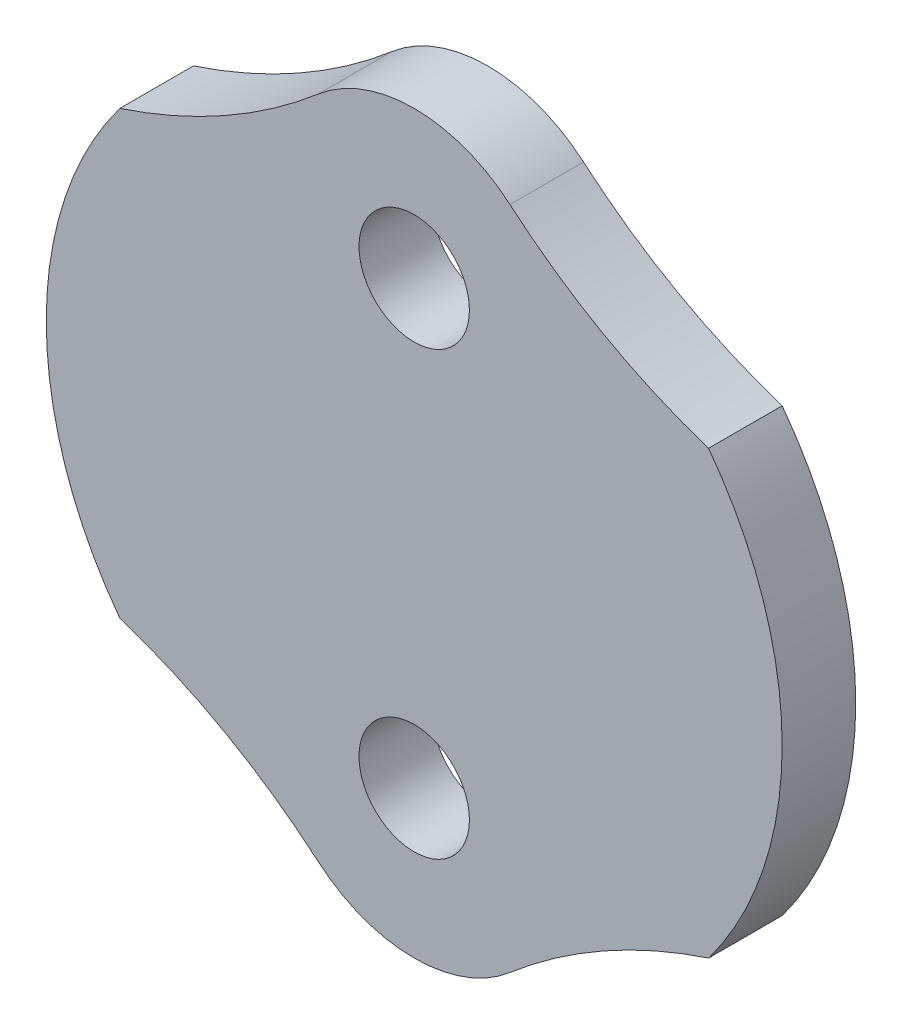
ISO-10303-21;
HEADER;
FILE_DESCRIPTION(('STEP AP214'),'2;1');
FILE_NAME('part.step','',(''),(''),'','','');
FILE_SCHEMA(('AUTOMOTIVE_DESIGN { 1 0 10303 214 1 1 1 1 }'));
ENDSEC;
DATA;
#1=APPLICATION_CONTEXT('core data for automotive mechanical design processes');
#2=APPLICATION_PROTOCOL_DEFINITION('international standard','automotive_design',2000,#1);
#3=PRODUCT_CONTEXT('',#1,'mechanical');
#4=PRODUCT('Part','Part','',(#3));
#5=PRODUCT_RELATED_PRODUCT_CATEGORY('part','',(#4));
#6=PRODUCT_DEFINITION_FORMATION('','',#4);
#7=PRODUCT_DEFINITION_CONTEXT('part definition',#1,'design');
#8=PRODUCT_DEFINITION('design','',#6,#7);
#9=PRODUCT_DEFINITION_SHAPE('','',#8);
#10=(LENGTH_UNIT() NAMED_UNIT(*) SI_UNIT(.MILLI.,.METRE.));
#11=(NAMED_UNIT(*) PLANE_ANGLE_UNIT() SI_UNIT($,.RADIAN.));
#12=(NAMED_UNIT(*) SI_UNIT($,.STERADIAN.) SOLID_ANGLE_UNIT());
#13=UNCERTAINTY_MEASURE_WITH_UNIT(LENGTH_MEASURE(1.E-05),#10,'distance_accuracy_value','');
#14=(GEOMETRIC_REPRESENTATION_CONTEXT(3) GLOBAL_UNCERTAINTY_ASSIGNED_CONTEXT((#13)) GLOBAL_UNIT_ASSIGNED_CONTEXT((#10,
#11,#12)) REPRESENTATION_CONTEXT('',''));
#15=CARTESIAN_POINT('',(0.,0.,0.));
#16=DIRECTION('',(0.,0.,1.));
#17=DIRECTION('',(1.,0.,0.));
#18=AXIS2_PLACEMENT_3D('',#15,#16,#17);
#19=CARTESIAN_POINT('',(0.,9.525,3.175));
#20=DIRECTION('',(0.,0.,1.));
#21=DIRECTION('',(1.,0.,0.));
#22=AXIS2_PLACEMENT_3D('',#19,#20,#21);
#23=PLANE('',#22);
#24=CARTESIAN_POINT('',(0.,19.05,3.175));
#25=DIRECTION('',(0.,0.,1.));
#26=DIRECTION('',(1.,0.,0.));
#27=AXIS2_PLACEMENT_3D('',#24,#25,#26);
#28=CIRCLE('',#27,2.38125);
#29=CARTESIAN_POINT('',(2.38125,19.05,3.175));
#30=VERTEX_POINT('',#29);
#31=EDGE_CURVE('E159',#30,#30,#28,.T.);
#32=ORIENTED_EDGE('',*,*,#31,.F.);
#33=EDGE_LOOP('',(#32));
#34=FACE_BOUND('',#33,.T.);
#35=CARTESIAN_POINT('',(0.,0.,3.175));
#36=DIRECTION('',(0.,0.,1.));
#37=DIRECTION('',(1.,0.,0.));
#38=AXIS2_PLACEMENT_3D('',#35,#36,#37);
#39=CIRCLE('',#38,2.38125);
#40=CARTESIAN_POINT('',(2.38125,0.,3.175));
#41=VERTEX_POINT('',#40);
#42=EDGE_CURVE('E165',#41,#41,#39,.T.);
#43=ORIENTED_EDGE('',*,*,#42,.F.);
#44=EDGE_LOOP('',(#43));
#45=FACE_BOUND('',#44,.T.);
#46=CARTESIAN_POINT('',(0.,9.525,3.175));
#47=DIRECTION('',(0.,0.,1.));
#48=DIRECTION('',(1.,0.,0.));
#49=AXIS2_PLACEMENT_3D('',#46,#47,#48);
#50=CIRCLE('',#49,15.875);
#51=CARTESIAN_POINT('',(-12.7,19.05,3.175));
#52=VERTEX_POINT('',#51);
#53=CARTESIAN_POINT('',(-12.7,0.,3.175));
#54=VERTEX_POINT('',#53);
#55=EDGE_CURVE('E11',#52,#54,#50,.T.);
#56=ORIENTED_EDGE('',*,*,#55,.T.);
#57=CARTESIAN_POINT('',(-20.5917749442092,-24.0466751482304,3.175));
#58=DIRECTION('',(0.,0.,1.));
#59=DIRECTION('',(1.,0.,0.));
#60=AXIS2_PLACEMENT_3D('',#57,#58,#59);
#61=CIRCLE('',#60,25.3085498884185);
#62=CARTESIAN_POINT('',(-4.13025142833731,-4.82322746081061,3.175));
#63=VERTEX_POINT('',#62);
#64=EDGE_CURVE('E125',#54,#63,#61,.F.);
#65=ORIENTED_EDGE('',*,*,#64,.T.);
#66=CARTESIAN_POINT('',(0.,0.,3.175));
#67=DIRECTION('',(0.,0.,1.));
#68=DIRECTION('',(1.,0.,0.));
#69=AXIS2_PLACEMENT_3D('',#66,#67,#68);
#70=CIRCLE('',#69,6.35);
#71=CARTESIAN_POINT('',(4.13025142833731,-4.82322746081061,3.175));
#72=VERTEX_POINT('',#71);
#73=EDGE_CURVE('E139',#63,#72,#70,.T.);
#74=ORIENTED_EDGE('',*,*,#73,.T.);
#75=CARTESIAN_POINT('',(20.5917749442092,-24.0466751482304,3.175));
#76=DIRECTION('',(0.,0.,1.));
#77=DIRECTION('',(1.,0.,0.));
#78=AXIS2_PLACEMENT_3D('',#75,#76,#77);
#79=CIRCLE('',#78,25.3085498884185);
#80=CARTESIAN_POINT('',(12.7,0.,3.175));
#81=VERTEX_POINT('',#80);
#82=EDGE_CURVE('E136',#81,#72,#79,.T.);
#83=ORIENTED_EDGE('',*,*,#82,.F.);
#84=CARTESIAN_POINT('',(12.7,19.05,3.175));
#85=VERTEX_POINT('',#84);
#86=EDGE_CURVE('E42',#81,#85,#50,.T.);
#87=ORIENTED_EDGE('',*,*,#86,.T.);
#88=CARTESIAN_POINT('',(20.5917749442092,43.0966751482304,3.175));
#89=DIRECTION('',(0.,0.,1.));
#90=DIRECTION('',(1.,0.,0.));
#91=AXIS2_PLACEMENT_3D('',#88,#89,#90);
#92=CIRCLE('',#91,25.3085498884185);
#93=CARTESIAN_POINT('',(4.13025142833731,23.8732274608106,3.175));
#94=VERTEX_POINT('',#93);
#95=EDGE_CURVE('E57',#85,#94,#92,.F.);
#96=ORIENTED_EDGE('',*,*,#95,.T.);
#97=CARTESIAN_POINT('',(0.,19.05,3.175));
#98=DIRECTION('',(0.,0.,1.));
#99=DIRECTION('',(1.,0.,0.));
#100=AXIS2_PLACEMENT_3D('',#97,#98,#99);
#101=CIRCLE('',#100,6.35);
#102=CARTESIAN_POINT('',(-4.13025142833731,23.8732274608106,3.175));
#103=VERTEX_POINT('',#102);
#104=EDGE_CURVE('E114',#94,#103,#101,.T.);
#105=ORIENTED_EDGE('',*,*,#104,.T.);
#106=CARTESIAN_POINT('',(-20.5917749442092,43.0966751482304,3.175));
#107=DIRECTION('',(0.,0.,1.));
#108=DIRECTION('',(1.,0.,0.));
#109=AXIS2_PLACEMENT_3D('',#106,#107,#108);
#110=CIRCLE('',#109,25.3085498884185);
#111=EDGE_CURVE('E122',#52,#103,#110,.T.);
#112=ORIENTED_EDGE('',*,*,#111,.F.);
#113=EDGE_LOOP('',(#56,#65,#74,#83,#87,#96,#105,#112));
#114=FACE_BOUND('',#113,.T.);
#115=ADVANCED_FACE('F33',(#34,#45,#114),#23,.T.);
#116=CARTESIAN_POINT('',(0.,9.525,0.));
#117=DIRECTION('',(0.,0.,1.));
#118=DIRECTION('',(1.,0.,0.));
#119=AXIS2_PLACEMENT_3D('',#116,#117,#118);
#120=PLANE('',#119);
#121=CARTESIAN_POINT('',(-20.5917749442092,-24.0466751482304,0.));
#122=DIRECTION('',(0.,0.,1.));
#123=DIRECTION('',(1.,0.,0.));
#124=AXIS2_PLACEMENT_3D('',#121,#122,#123);
#125=CIRCLE('',#124,25.3085498884185);
#126=CARTESIAN_POINT('',(-12.7,0.,0.));
#127=VERTEX_POINT('',#126);
#128=CARTESIAN_POINT('',(-4.13025142833731,-4.82322746081061,0.));
#129=VERTEX_POINT('',#128);
#130=EDGE_CURVE('E131',#127,#129,#125,.F.);
#131=ORIENTED_EDGE('',*,*,#130,.F.);
#132=CARTESIAN_POINT('',(0.,9.525,0.));
#133=DIRECTION('',(0.,0.,1.));
#134=DIRECTION('',(1.,0.,0.));
#135=AXIS2_PLACEMENT_3D('',#132,#133,#134);
#136=CIRCLE('',#135,15.875);
#137=CARTESIAN_POINT('',(-12.7,19.05,0.));
#138=VERTEX_POINT('',#137);
#139=EDGE_CURVE('E170',#138,#127,#136,.T.);
#140=ORIENTED_EDGE('',*,*,#139,.F.);
#141=CARTESIAN_POINT('',(-20.5917749442092,43.0966751482304,0.));
#142=DIRECTION('',(0.,0.,1.));
#143=DIRECTION('',(1.,0.,0.));
#144=AXIS2_PLACEMENT_3D('',#141,#142,#143);
#145=CIRCLE('',#144,25.3085498884185);
#146=CARTESIAN_POINT('',(-4.13025142833731,23.8732274608106,0.));
#147=VERTEX_POINT('',#146);
#148=EDGE_CURVE('E115',#138,#147,#145,.T.);
#149=ORIENTED_EDGE('',*,*,#148,.T.);
#150=CARTESIAN_POINT('',(0.,19.05,0.));
#151=DIRECTION('',(0.,0.,1.));
#152=DIRECTION('',(1.,0.,0.));
#153=AXIS2_PLACEMENT_3D('',#150,#151,#152);
#154=CIRCLE('',#153,6.35);
#155=CARTESIAN_POINT('',(4.13025142833731,23.8732274608106,0.));
#156=VERTEX_POINT('',#155);
#157=EDGE_CURVE('E108',#156,#147,#154,.T.);
#158=ORIENTED_EDGE('',*,*,#157,.F.);
#159=CARTESIAN_POINT('',(20.5917749442092,43.0966751482304,0.));
#160=DIRECTION('',(0.,0.,1.));
#161=DIRECTION('',(1.,0.,0.));
#162=AXIS2_PLACEMENT_3D('',#159,#160,#161);
#163=CIRCLE('',#162,25.3085498884185);
#164=CARTESIAN_POINT('',(12.7,19.05,0.));
#165=VERTEX_POINT('',#164);
#166=EDGE_CURVE('E98',#165,#156,#163,.F.);
#167=ORIENTED_EDGE('',*,*,#166,.F.);
#168=CARTESIAN_POINT('',(12.7,0.,0.));
#169=VERTEX_POINT('',#168);
#170=EDGE_CURVE('E37',#169,#165,#136,.T.);
#171=ORIENTED_EDGE('',*,*,#170,.F.);
#172=CARTESIAN_POINT('',(20.5917749442092,-24.0466751482304,0.));
#173=DIRECTION('',(0.,0.,1.));
#174=DIRECTION('',(1.,0.,0.));
#175=AXIS2_PLACEMENT_3D('',#172,#173,#174);
#176=CIRCLE('',#175,25.3085498884185);
#177=CARTESIAN_POINT('',(4.13025142833731,-4.82322746081061,0.));
#178=VERTEX_POINT('',#177);
#179=EDGE_CURVE('E49',#169,#178,#176,.T.);
#180=ORIENTED_EDGE('',*,*,#179,.T.);
#181=CARTESIAN_POINT('',(0.,0.,0.));
#182=DIRECTION('',(0.,0.,1.));
#183=DIRECTION('',(1.,0.,0.));
#184=AXIS2_PLACEMENT_3D('',#181,#182,#183);
#185=CIRCLE('',#184,6.35);
#186=EDGE_CURVE('E129',#129,#178,#185,.T.);
#187=ORIENTED_EDGE('',*,*,#186,.F.);
#188=EDGE_LOOP('',(#131,#140,#149,#158,#167,#171,#180,#187));
#189=FACE_BOUND('',#188,.T.);
#190=CARTESIAN_POINT('',(0.,0.,0.));
#191=DIRECTION('',(0.,0.,1.));
#192=DIRECTION('',(1.,0.,0.));
#193=AXIS2_PLACEMENT_3D('',#190,#191,#192);
#194=CIRCLE('',#193,2.38125);
#195=CARTESIAN_POINT('',(2.38125,0.,0.));
#196=VERTEX_POINT('',#195);
#197=EDGE_CURVE('E162',#196,#196,#194,.T.);
#198=ORIENTED_EDGE('',*,*,#197,.T.);
#199=EDGE_LOOP('',(#198));
#200=FACE_BOUND('',#199,.T.);
#201=CARTESIAN_POINT('',(0.,19.05,0.));
#202=DIRECTION('',(0.,0.,1.));
#203=DIRECTION('',(1.,0.,0.));
#204=AXIS2_PLACEMENT_3D('',#201,#202,#203);
#205=CIRCLE('',#204,2.38125);
#206=CARTESIAN_POINT('',(2.38125,19.05,0.));
#207=VERTEX_POINT('',#206);
#208=EDGE_CURVE('E145',#207,#207,#205,.T.);
#209=ORIENTED_EDGE('',*,*,#208,.T.);
#210=EDGE_LOOP('',(#209));
#211=FACE_BOUND('',#210,.T.);
#212=ADVANCED_FACE('F119',(#189,#200,#211),#120,.F.);
#213=CARTESIAN_POINT('',(0.,9.525,3.175));
#214=DIRECTION('',(0.,0.,-1.));
#215=DIRECTION('',(-1.,0.,0.));
#216=AXIS2_PLACEMENT_3D('',#213,#214,#215);
#217=CYLINDRICAL_SURFACE('',#216,15.875);
#218=ORIENTED_EDGE('',*,*,#55,.F.);
#219=DIRECTION('',(0.,0.,1.));
#220=VECTOR('',#219,1.);
#221=CARTESIAN_POINT('',(-12.7,19.05,0.));
#222=LINE('',#221,#220);
#223=EDGE_CURVE('E146',#138,#52,#222,.T.);
#224=ORIENTED_EDGE('',*,*,#223,.F.);
#225=ORIENTED_EDGE('',*,*,#139,.T.);
#226=DIRECTION('',(0.,0.,1.));
#227=VECTOR('',#226,1.);
#228=CARTESIAN_POINT('',(-12.7,0.,0.));
#229=LINE('',#228,#227);
#230=EDGE_CURVE('E148',#127,#54,#229,.T.);
#231=ORIENTED_EDGE('',*,*,#230,.T.);
#232=EDGE_LOOP('',(#218,#224,#225,#231));
#233=FACE_BOUND('',#232,.T.);
#234=ADVANCED_FACE('F188',(#233),#217,.T.);
#235=ORIENTED_EDGE('',*,*,#86,.F.);
#236=DIRECTION('',(0.,0.,1.));
#237=VECTOR('',#236,1.);
#238=CARTESIAN_POINT('',(12.7,0.,0.));
#239=LINE('',#238,#237);
#240=EDGE_CURVE('E156',#169,#81,#239,.T.);
#241=ORIENTED_EDGE('',*,*,#240,.F.);
#242=ORIENTED_EDGE('',*,*,#170,.T.);
#243=DIRECTION('',(0.,0.,1.));
#244=VECTOR('',#243,1.);
#245=CARTESIAN_POINT('',(12.7,19.05,0.));
#246=LINE('',#245,#244);
#247=EDGE_CURVE('E103',#165,#85,#246,.T.);
#248=ORIENTED_EDGE('',*,*,#247,.T.);
#249=EDGE_LOOP('',(#235,#241,#242,#248));
#250=FACE_BOUND('',#249,.T.);
#251=ADVANCED_FACE('F35',(#250),#217,.T.);
#252=CARTESIAN_POINT('',(0.,0.,3.175));
#253=DIRECTION('',(0.,0.,-1.));
#254=DIRECTION('',(-1.,0.,0.));
#255=AXIS2_PLACEMENT_3D('',#252,#253,#254);
#256=CYLINDRICAL_SURFACE('',#255,2.38125);
#257=ORIENTED_EDGE('',*,*,#42,.T.);
#258=EDGE_LOOP('',(#257));
#259=FACE_BOUND('',#258,.T.);
#260=ORIENTED_EDGE('',*,*,#197,.F.);
#261=EDGE_LOOP('',(#260));
#262=FACE_BOUND('',#261,.T.);
#263=ADVANCED_FACE('F211',(#259,#262),#256,.F.);
#264=CARTESIAN_POINT('',(0.,19.05,3.175));
#265=DIRECTION('',(0.,0.,-1.));
#266=DIRECTION('',(-1.,0.,0.));
#267=AXIS2_PLACEMENT_3D('',#264,#265,#266);
#268=CYLINDRICAL_SURFACE('',#267,2.38125);
#269=ORIENTED_EDGE('',*,*,#31,.T.);
#270=EDGE_LOOP('',(#269));
#271=FACE_BOUND('',#270,.T.);
#272=ORIENTED_EDGE('',*,*,#208,.F.);
#273=EDGE_LOOP('',(#272));
#274=FACE_BOUND('',#273,.T.);
#275=ADVANCED_FACE('F198',(#271,#274),#268,.F.);
#276=CARTESIAN_POINT('',(20.5917749442092,43.0966751482304,0.));
#277=DIRECTION('',(0.,0.,1.));
#278=DIRECTION('',(1.,0.,0.));
#279=AXIS2_PLACEMENT_3D('',#276,#277,#278);
#280=CYLINDRICAL_SURFACE('',#279,25.3085498884185);
#281=ORIENTED_EDGE('',*,*,#95,.F.);
#282=ORIENTED_EDGE('',*,*,#247,.F.);
#283=ORIENTED_EDGE('',*,*,#166,.T.);
#284=DIRECTION('',(0.,0.,1.));
#285=VECTOR('',#284,1.);
#286=CARTESIAN_POINT('',(4.13025142833731,23.8732274608106,0.));
#287=LINE('',#286,#285);
#288=EDGE_CURVE('E101',#156,#94,#287,.T.);
#289=ORIENTED_EDGE('',*,*,#288,.T.);
#290=EDGE_LOOP('',(#281,#282,#283,#289));
#291=FACE_BOUND('',#290,.T.);
#292=ADVANCED_FACE('F100',(#291),#280,.F.);
#293=CARTESIAN_POINT('',(-20.5917749442092,43.0966751482304,0.));
#294=DIRECTION('',(0.,0.,1.));
#295=DIRECTION('',(1.,0.,0.));
#296=AXIS2_PLACEMENT_3D('',#293,#294,#295);
#297=CYLINDRICAL_SURFACE('',#296,25.3085498884185);
#298=ORIENTED_EDGE('',*,*,#111,.T.);
#299=DIRECTION('',(0.,0.,1.));
#300=VECTOR('',#299,1.);
#301=CARTESIAN_POINT('',(-4.13025142833731,23.8732274608106,0.));
#302=LINE('',#301,#300);
#303=EDGE_CURVE('E143',#147,#103,#302,.T.);
#304=ORIENTED_EDGE('',*,*,#303,.F.);
#305=ORIENTED_EDGE('',*,*,#148,.F.);
#306=ORIENTED_EDGE('',*,*,#223,.T.);
#307=EDGE_LOOP('',(#298,#304,#305,#306));
#308=FACE_BOUND('',#307,.T.);
#309=ADVANCED_FACE('F190',(#308),#297,.F.);
#310=CARTESIAN_POINT('',(0.,19.05,0.));
#311=DIRECTION('',(0.,0.,1.));
#312=DIRECTION('',(1.,0.,0.));
#313=AXIS2_PLACEMENT_3D('',#310,#311,#312);
#314=CYLINDRICAL_SURFACE('',#313,6.35);
#315=ORIENTED_EDGE('',*,*,#157,.T.);
#316=ORIENTED_EDGE('',*,*,#303,.T.);
#317=ORIENTED_EDGE('',*,*,#104,.F.);
#318=ORIENTED_EDGE('',*,*,#288,.F.);
#319=EDGE_LOOP('',(#315,#316,#317,#318));
#320=FACE_BOUND('',#319,.T.);
#321=ADVANCED_FACE('F111',(#320),#314,.T.);
#322=CARTESIAN_POINT('',(0.,0.,0.));
#323=DIRECTION('',(0.,0.,1.));
#324=DIRECTION('',(1.,0.,0.));
#325=AXIS2_PLACEMENT_3D('',#322,#323,#324);
#326=CYLINDRICAL_SURFACE('',#325,6.35);
#327=ORIENTED_EDGE('',*,*,#186,.T.);
#328=DIRECTION('',(0.,0.,1.));
#329=VECTOR('',#328,1.);
#330=CARTESIAN_POINT('',(4.13025142833731,-4.82322746081061,0.));
#331=LINE('',#330,#329);
#332=EDGE_CURVE('E153',#178,#72,#331,.T.);
#333=ORIENTED_EDGE('',*,*,#332,.T.);
#334=ORIENTED_EDGE('',*,*,#73,.F.);
#335=DIRECTION('',(0.,0.,1.));
#336=VECTOR('',#335,1.);
#337=CARTESIAN_POINT('',(-4.13025142833731,-4.82322746081061,0.));
#338=LINE('',#337,#336);
#339=EDGE_CURVE('E151',#129,#63,#338,.T.);
#340=ORIENTED_EDGE('',*,*,#339,.F.);
#341=EDGE_LOOP('',(#327,#333,#334,#340));
#342=FACE_BOUND('',#341,.T.);
#343=ADVANCED_FACE('F181',(#342),#326,.T.);
#344=CARTESIAN_POINT('',(-20.5917749442092,-24.0466751482304,0.));
#345=DIRECTION('',(0.,0.,1.));
#346=DIRECTION('',(1.,0.,0.));
#347=AXIS2_PLACEMENT_3D('',#344,#345,#346);
#348=CYLINDRICAL_SURFACE('',#347,25.3085498884185);
#349=ORIENTED_EDGE('',*,*,#64,.F.);
#350=ORIENTED_EDGE('',*,*,#230,.F.);
#351=ORIENTED_EDGE('',*,*,#130,.T.);
#352=ORIENTED_EDGE('',*,*,#339,.T.);
#353=EDGE_LOOP('',(#349,#350,#351,#352));
#354=FACE_BOUND('',#353,.T.);
#355=ADVANCED_FACE('F187',(#354),#348,.F.);
#356=CARTESIAN_POINT('',(20.5917749442092,-24.0466751482304,0.));
#357=DIRECTION('',(0.,0.,1.));
#358=DIRECTION('',(1.,0.,0.));
#359=AXIS2_PLACEMENT_3D('',#356,#357,#358);
#360=CYLINDRICAL_SURFACE('',#359,25.3085498884185);
#361=ORIENTED_EDGE('',*,*,#82,.T.);
#362=ORIENTED_EDGE('',*,*,#332,.F.);
#363=ORIENTED_EDGE('',*,*,#179,.F.);
#364=ORIENTED_EDGE('',*,*,#240,.T.);
#365=EDGE_LOOP('',(#361,#362,#363,#364));
#366=FACE_BOUND('',#365,.T.);
#367=ADVANCED_FACE('F183',(#366),#360,.F.);
#368=CLOSED_SHELL('',(#115,#212,#234,#251,#263,#275,#292,#309,#321,#343,#355,#367));
#369=MANIFOLD_SOLID_BREP('B2',#368);
#370=ADVANCED_BREP_SHAPE_REPRESENTATION('',(#18,#369),#14);
#371=SHAPE_DEFINITION_REPRESENTATION(#9,#370);
ENDSEC;
END-ISO-10303-21;
